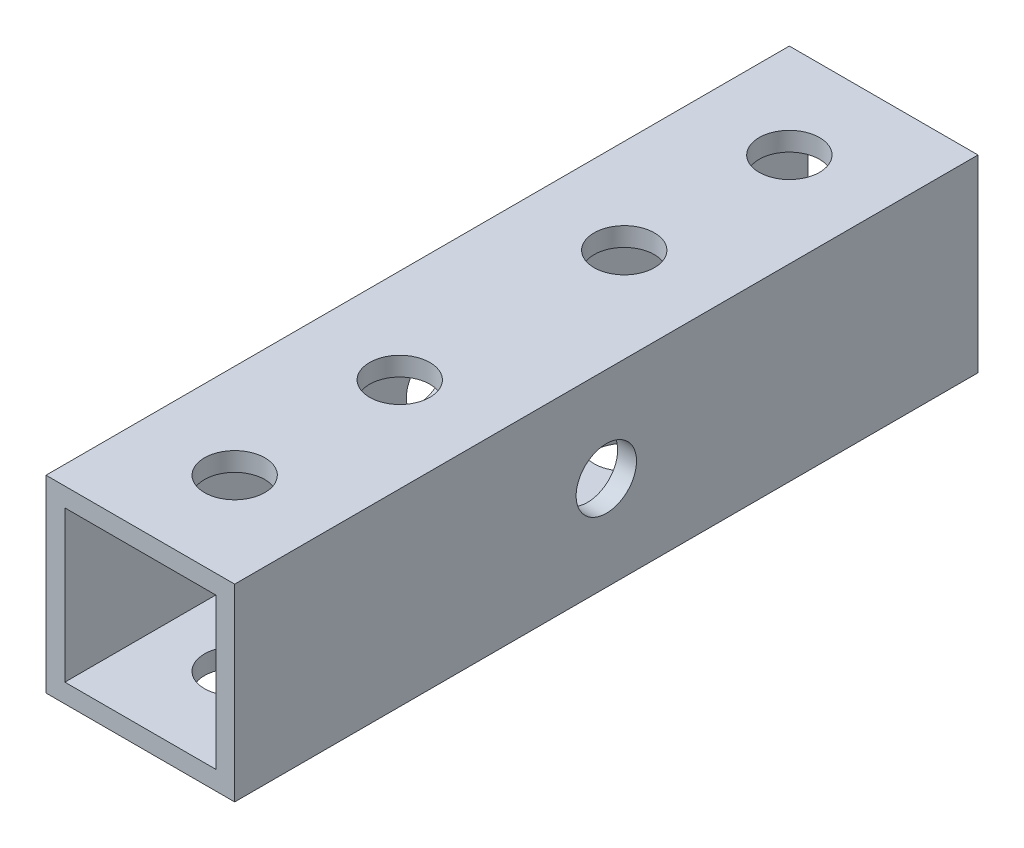
ISO-10303-21;
HEADER;
FILE_DESCRIPTION(('STEP AP214'),'2;1');
FILE_NAME('part.step','',(''),(''),'','','');
FILE_SCHEMA(('AUTOMOTIVE_DESIGN { 1 0 10303 214 1 1 1 1 }'));
ENDSEC;
DATA;
#1=APPLICATION_CONTEXT('core data for automotive mechanical design processes');
#2=APPLICATION_PROTOCOL_DEFINITION('international standard','automotive_design',2000,#1);
#3=PRODUCT_CONTEXT('',#1,'mechanical');
#4=PRODUCT('Part','Part','',(#3));
#5=PRODUCT_RELATED_PRODUCT_CATEGORY('part','',(#4));
#6=PRODUCT_DEFINITION_FORMATION('','',#4);
#7=PRODUCT_DEFINITION_CONTEXT('part definition',#1,'design');
#8=PRODUCT_DEFINITION('design','',#6,#7);
#9=PRODUCT_DEFINITION_SHAPE('','',#8);
#10=(LENGTH_UNIT() NAMED_UNIT(*) SI_UNIT(.MILLI.,.METRE.));
#11=(NAMED_UNIT(*) PLANE_ANGLE_UNIT() SI_UNIT($,.RADIAN.));
#12=(NAMED_UNIT(*) SI_UNIT($,.STERADIAN.) SOLID_ANGLE_UNIT());
#13=UNCERTAINTY_MEASURE_WITH_UNIT(LENGTH_MEASURE(1.E-05),#10,'distance_accuracy_value','');
#14=(GEOMETRIC_REPRESENTATION_CONTEXT(3) GLOBAL_UNCERTAINTY_ASSIGNED_CONTEXT((#13)) GLOBAL_UNIT_ASSIGNED_CONTEXT((#10,
#11,#12)) REPRESENTATION_CONTEXT('',''));
#15=CARTESIAN_POINT('',(0.,0.,0.));
#16=DIRECTION('',(0.,0.,1.));
#17=DIRECTION('',(1.,0.,0.));
#18=AXIS2_PLACEMENT_3D('',#15,#16,#17);
#19=CARTESIAN_POINT('',(0.,0.,39.4));
#20=DIRECTION('',(0.,0.,1.));
#21=DIRECTION('',(1.,0.,0.));
#22=AXIS2_PLACEMENT_3D('',#19,#20,#21);
#23=PLANE('',#22);
#24=DIRECTION('',(0.,1.,0.));
#25=VECTOR('',#24,1.);
#26=CARTESIAN_POINT('',(5.,-5.,39.4));
#27=LINE('',#26,#25);
#28=CARTESIAN_POINT('',(5.,-5.,39.4));
#29=VERTEX_POINT('',#28);
#30=CARTESIAN_POINT('',(5.,5.,39.4));
#31=VERTEX_POINT('',#30);
#32=EDGE_CURVE('E164',#29,#31,#27,.T.);
#33=ORIENTED_EDGE('',*,*,#32,.T.);
#34=DIRECTION('',(-1.,0.,0.));
#35=VECTOR('',#34,1.);
#36=CARTESIAN_POINT('',(-5.,5.,39.4));
#37=LINE('',#36,#35);
#38=CARTESIAN_POINT('',(-5.,5.,39.4));
#39=VERTEX_POINT('',#38);
#40=EDGE_CURVE('E167',#31,#39,#37,.T.);
#41=ORIENTED_EDGE('',*,*,#40,.T.);
#42=DIRECTION('',(0.,-1.,0.));
#43=VECTOR('',#42,1.);
#44=CARTESIAN_POINT('',(-5.,-5.,39.4));
#45=LINE('',#44,#43);
#46=CARTESIAN_POINT('',(-5.,-5.,39.4));
#47=VERTEX_POINT('',#46);
#48=EDGE_CURVE('E170',#39,#47,#45,.T.);
#49=ORIENTED_EDGE('',*,*,#48,.T.);
#50=DIRECTION('',(1.,0.,0.));
#51=VECTOR('',#50,1.);
#52=CARTESIAN_POINT('',(-5.,-5.,39.4));
#53=LINE('',#52,#51);
#54=EDGE_CURVE('E172',#47,#29,#53,.T.);
#55=ORIENTED_EDGE('',*,*,#54,.T.);
#56=EDGE_LOOP('',(#33,#41,#49,#55));
#57=FACE_BOUND('',#56,.T.);
#58=DIRECTION('',(-1.,0.,0.));
#59=VECTOR('',#58,1.);
#60=CARTESIAN_POINT('',(0.,4.,39.4));
#61=LINE('',#60,#59);
#62=CARTESIAN_POINT('',(4.,4.,39.4));
#63=VERTEX_POINT('',#62);
#64=CARTESIAN_POINT('',(-4.,4.,39.4));
#65=VERTEX_POINT('',#64);
#66=EDGE_CURVE('E134',#63,#65,#61,.T.);
#67=ORIENTED_EDGE('',*,*,#66,.F.);
#68=DIRECTION('',(0.,1.,0.));
#69=VECTOR('',#68,1.);
#70=CARTESIAN_POINT('',(4.,0.,39.4));
#71=LINE('',#70,#69);
#72=CARTESIAN_POINT('',(4.,-4.,39.4));
#73=VERTEX_POINT('',#72);
#74=EDGE_CURVE('E126',#73,#63,#71,.T.);
#75=ORIENTED_EDGE('',*,*,#74,.F.);
#76=DIRECTION('',(1.,0.,0.));
#77=VECTOR('',#76,1.);
#78=CARTESIAN_POINT('',(0.,-4.,39.4));
#79=LINE('',#78,#77);
#80=CARTESIAN_POINT('',(-4.,-4.,39.4));
#81=VERTEX_POINT('',#80);
#82=EDGE_CURVE('E148',#81,#73,#79,.T.);
#83=ORIENTED_EDGE('',*,*,#82,.F.);
#84=DIRECTION('',(0.,-1.,0.));
#85=VECTOR('',#84,1.);
#86=CARTESIAN_POINT('',(-4.,0.,39.4));
#87=LINE('',#86,#85);
#88=EDGE_CURVE('E146',#65,#81,#87,.T.);
#89=ORIENTED_EDGE('',*,*,#88,.F.);
#90=EDGE_LOOP('',(#67,#75,#83,#89));
#91=FACE_BOUND('',#90,.T.);
#92=ADVANCED_FACE('F59',(#57,#91),#23,.T.);
#93=CARTESIAN_POINT('',(0.,0.,0.));
#94=DIRECTION('',(0.,0.,1.));
#95=DIRECTION('',(1.,0.,0.));
#96=AXIS2_PLACEMENT_3D('',#93,#94,#95);
#97=PLANE('',#96);
#98=DIRECTION('',(0.,1.,0.));
#99=VECTOR('',#98,1.);
#100=CARTESIAN_POINT('',(5.,-5.,0.));
#101=LINE('',#100,#99);
#102=CARTESIAN_POINT('',(5.,-5.,0.));
#103=VERTEX_POINT('',#102);
#104=CARTESIAN_POINT('',(5.,5.,0.));
#105=VERTEX_POINT('',#104);
#106=EDGE_CURVE('E142',#103,#105,#101,.T.);
#107=ORIENTED_EDGE('',*,*,#106,.F.);
#108=DIRECTION('',(1.,0.,0.));
#109=VECTOR('',#108,1.);
#110=CARTESIAN_POINT('',(-5.,-5.,0.));
#111=LINE('',#110,#109);
#112=CARTESIAN_POINT('',(-5.,-5.,0.));
#113=VERTEX_POINT('',#112);
#114=EDGE_CURVE('E168',#113,#103,#111,.T.);
#115=ORIENTED_EDGE('',*,*,#114,.F.);
#116=DIRECTION('',(0.,-1.,0.));
#117=VECTOR('',#116,1.);
#118=CARTESIAN_POINT('',(-5.,-5.,0.));
#119=LINE('',#118,#117);
#120=CARTESIAN_POINT('',(-5.,5.,0.));
#121=VERTEX_POINT('',#120);
#122=EDGE_CURVE('E179',#121,#113,#119,.T.);
#123=ORIENTED_EDGE('',*,*,#122,.F.);
#124=DIRECTION('',(-1.,0.,0.));
#125=VECTOR('',#124,1.);
#126=CARTESIAN_POINT('',(-5.,5.,0.));
#127=LINE('',#126,#125);
#128=EDGE_CURVE('E177',#105,#121,#127,.T.);
#129=ORIENTED_EDGE('',*,*,#128,.F.);
#130=EDGE_LOOP('',(#107,#115,#123,#129));
#131=FACE_BOUND('',#130,.T.);
#132=DIRECTION('',(0.,1.,0.));
#133=VECTOR('',#132,1.);
#134=CARTESIAN_POINT('',(4.,0.,0.));
#135=LINE('',#134,#133);
#136=CARTESIAN_POINT('',(4.,-4.,0.));
#137=VERTEX_POINT('',#136);
#138=CARTESIAN_POINT('',(4.,4.,0.));
#139=VERTEX_POINT('',#138);
#140=EDGE_CURVE('E84',#137,#139,#135,.T.);
#141=ORIENTED_EDGE('',*,*,#140,.T.);
#142=DIRECTION('',(-1.,0.,0.));
#143=VECTOR('',#142,1.);
#144=CARTESIAN_POINT('',(0.,4.,0.));
#145=LINE('',#144,#143);
#146=CARTESIAN_POINT('',(-4.,4.,0.));
#147=VERTEX_POINT('',#146);
#148=EDGE_CURVE('E141',#139,#147,#145,.T.);
#149=ORIENTED_EDGE('',*,*,#148,.T.);
#150=DIRECTION('',(0.,-1.,0.));
#151=VECTOR('',#150,1.);
#152=CARTESIAN_POINT('',(-4.,0.,0.));
#153=LINE('',#152,#151);
#154=CARTESIAN_POINT('',(-4.,-4.,0.));
#155=VERTEX_POINT('',#154);
#156=EDGE_CURVE('E156',#147,#155,#153,.T.);
#157=ORIENTED_EDGE('',*,*,#156,.T.);
#158=DIRECTION('',(1.,0.,0.));
#159=VECTOR('',#158,1.);
#160=CARTESIAN_POINT('',(0.,-4.,0.));
#161=LINE('',#160,#159);
#162=EDGE_CURVE('E135',#155,#137,#161,.T.);
#163=ORIENTED_EDGE('',*,*,#162,.T.);
#164=EDGE_LOOP('',(#141,#149,#157,#163));
#165=FACE_BOUND('',#164,.T.);
#166=ADVANCED_FACE('F263',(#131,#165),#97,.F.);
#167=CARTESIAN_POINT('',(5.,-5.,39.4));
#168=DIRECTION('',(-1.,0.,0.));
#169=DIRECTION('',(0.,0.,1.));
#170=AXIS2_PLACEMENT_3D('',#167,#168,#169);
#171=PLANE('',#170);
#172=CARTESIAN_POINT('',(5.,0.,19.7));
#173=DIRECTION('',(1.,0.,0.));
#174=DIRECTION('',(0.,0.,-1.));
#175=AXIS2_PLACEMENT_3D('',#172,#173,#174);
#176=CIRCLE('',#175,1.6);
#177=CARTESIAN_POINT('',(5.,0.,18.1));
#178=VERTEX_POINT('',#177);
#179=EDGE_CURVE('E291',#178,#178,#176,.T.);
#180=ORIENTED_EDGE('',*,*,#179,.F.);
#181=EDGE_LOOP('',(#180));
#182=FACE_BOUND('',#181,.T.);
#183=ORIENTED_EDGE('',*,*,#106,.T.);
#184=DIRECTION('',(0.,0.,-1.));
#185=VECTOR('',#184,1.);
#186=CARTESIAN_POINT('',(5.,5.,39.4));
#187=LINE('',#186,#185);
#188=EDGE_CURVE('E12',#31,#105,#187,.T.);
#189=ORIENTED_EDGE('',*,*,#188,.F.);
#190=ORIENTED_EDGE('',*,*,#32,.F.);
#191=DIRECTION('',(0.,0.,-1.));
#192=VECTOR('',#191,1.);
#193=CARTESIAN_POINT('',(5.,-5.,39.4));
#194=LINE('',#193,#192);
#195=EDGE_CURVE('E174',#29,#103,#194,.T.);
#196=ORIENTED_EDGE('',*,*,#195,.T.);
#197=EDGE_LOOP('',(#183,#189,#190,#196));
#198=FACE_BOUND('',#197,.T.);
#199=ADVANCED_FACE('F61',(#182,#198),#171,.F.);
#200=CARTESIAN_POINT('',(-5.,5.,39.4));
#201=DIRECTION('',(0.,-1.,0.));
#202=DIRECTION('',(0.,0.,-1.));
#203=AXIS2_PLACEMENT_3D('',#200,#201,#202);
#204=PLANE('',#203);
#205=CARTESIAN_POINT('',(0.,5.,13.75));
#206=DIRECTION('',(0.,1.,0.));
#207=DIRECTION('',(0.,0.,1.));
#208=AXIS2_PLACEMENT_3D('',#205,#206,#207);
#209=CIRCLE('',#208,1.6);
#210=CARTESIAN_POINT('',(0.,5.,15.35));
#211=VERTEX_POINT('',#210);
#212=EDGE_CURVE('E302',#211,#211,#209,.T.);
#213=ORIENTED_EDGE('',*,*,#212,.F.);
#214=EDGE_LOOP('',(#213));
#215=FACE_BOUND('',#214,.T.);
#216=CARTESIAN_POINT('',(0.,5.,25.65));
#217=DIRECTION('',(0.,1.,0.));
#218=DIRECTION('',(0.,0.,-1.));
#219=AXIS2_PLACEMENT_3D('',#216,#217,#218);
#220=CIRCLE('',#219,1.6);
#221=CARTESIAN_POINT('',(0.,5.,24.05));
#222=VERTEX_POINT('',#221);
#223=EDGE_CURVE('E214',#222,#222,#220,.T.);
#224=ORIENTED_EDGE('',*,*,#223,.F.);
#225=EDGE_LOOP('',(#224));
#226=FACE_BOUND('',#225,.T.);
#227=CARTESIAN_POINT('',(0.,5.,5.));
#228=DIRECTION('',(0.,1.,0.));
#229=DIRECTION('',(0.,0.,1.));
#230=AXIS2_PLACEMENT_3D('',#227,#228,#229);
#231=CIRCLE('',#230,1.6);
#232=CARTESIAN_POINT('',(0.,5.,6.6));
#233=VERTEX_POINT('',#232);
#234=EDGE_CURVE('E219',#233,#233,#231,.T.);
#235=ORIENTED_EDGE('',*,*,#234,.F.);
#236=EDGE_LOOP('',(#235));
#237=FACE_BOUND('',#236,.T.);
#238=CARTESIAN_POINT('',(0.,5.,34.4));
#239=DIRECTION('',(0.,1.,0.));
#240=DIRECTION('',(0.,0.,-1.));
#241=AXIS2_PLACEMENT_3D('',#238,#239,#240);
#242=CIRCLE('',#241,1.6);
#243=CARTESIAN_POINT('',(0.,5.,32.8));
#244=VERTEX_POINT('',#243);
#245=EDGE_CURVE('E207',#244,#244,#242,.T.);
#246=ORIENTED_EDGE('',*,*,#245,.F.);
#247=EDGE_LOOP('',(#246));
#248=FACE_BOUND('',#247,.T.);
#249=ORIENTED_EDGE('',*,*,#128,.T.);
#250=DIRECTION('',(0.,0.,-1.));
#251=VECTOR('',#250,1.);
#252=CARTESIAN_POINT('',(-5.,5.,39.4));
#253=LINE('',#252,#251);
#254=EDGE_CURVE('E68',#39,#121,#253,.T.);
#255=ORIENTED_EDGE('',*,*,#254,.F.);
#256=ORIENTED_EDGE('',*,*,#40,.F.);
#257=ORIENTED_EDGE('',*,*,#188,.T.);
#258=EDGE_LOOP('',(#249,#255,#256,#257));
#259=FACE_BOUND('',#258,.T.);
#260=ADVANCED_FACE('F249',(#215,#226,#237,#248,#259),#204,.F.);
#261=CARTESIAN_POINT('',(-5.,-5.,39.4));
#262=DIRECTION('',(1.,0.,0.));
#263=DIRECTION('',(0.,0.,-1.));
#264=AXIS2_PLACEMENT_3D('',#261,#262,#263);
#265=PLANE('',#264);
#266=CARTESIAN_POINT('',(-5.,0.,19.7));
#267=DIRECTION('',(1.,0.,0.));
#268=DIRECTION('',(0.,0.,-1.));
#269=AXIS2_PLACEMENT_3D('',#266,#267,#268);
#270=CIRCLE('',#269,1.6);
#271=CARTESIAN_POINT('',(-5.,0.,18.1));
#272=VERTEX_POINT('',#271);
#273=EDGE_CURVE('E289',#272,#272,#270,.T.);
#274=ORIENTED_EDGE('',*,*,#273,.T.);
#275=EDGE_LOOP('',(#274));
#276=FACE_BOUND('',#275,.T.);
#277=ORIENTED_EDGE('',*,*,#122,.T.);
#278=DIRECTION('',(0.,0.,-1.));
#279=VECTOR('',#278,1.);
#280=CARTESIAN_POINT('',(-5.,-5.,39.4));
#281=LINE('',#280,#279);
#282=EDGE_CURVE('E184',#47,#113,#281,.T.);
#283=ORIENTED_EDGE('',*,*,#282,.F.);
#284=ORIENTED_EDGE('',*,*,#48,.F.);
#285=ORIENTED_EDGE('',*,*,#254,.T.);
#286=EDGE_LOOP('',(#277,#283,#284,#285));
#287=FACE_BOUND('',#286,.T.);
#288=ADVANCED_FACE('F252',(#276,#287),#265,.F.);
#289=CARTESIAN_POINT('',(-5.,-5.,39.4));
#290=DIRECTION('',(0.,1.,0.));
#291=DIRECTION('',(0.,0.,1.));
#292=AXIS2_PLACEMENT_3D('',#289,#290,#291);
#293=PLANE('',#292);
#294=CARTESIAN_POINT('',(0.,-5.,13.75));
#295=DIRECTION('',(0.,1.,0.));
#296=DIRECTION('',(0.,0.,1.));
#297=AXIS2_PLACEMENT_3D('',#294,#295,#296);
#298=CIRCLE('',#297,1.6);
#299=CARTESIAN_POINT('',(0.,-5.,15.35));
#300=VERTEX_POINT('',#299);
#301=EDGE_CURVE('E200',#300,#300,#298,.T.);
#302=ORIENTED_EDGE('',*,*,#301,.T.);
#303=EDGE_LOOP('',(#302));
#304=FACE_BOUND('',#303,.T.);
#305=CARTESIAN_POINT('',(0.,-5.,25.65));
#306=DIRECTION('',(0.,1.,0.));
#307=DIRECTION('',(0.,0.,-1.));
#308=AXIS2_PLACEMENT_3D('',#305,#306,#307);
#309=CIRCLE('',#308,1.6);
#310=CARTESIAN_POINT('',(0.,-5.,24.05));
#311=VERTEX_POINT('',#310);
#312=EDGE_CURVE('E304',#311,#311,#309,.T.);
#313=ORIENTED_EDGE('',*,*,#312,.T.);
#314=EDGE_LOOP('',(#313));
#315=FACE_BOUND('',#314,.T.);
#316=CARTESIAN_POINT('',(0.,-5.,5.));
#317=DIRECTION('',(0.,1.,0.));
#318=DIRECTION('',(0.,0.,1.));
#319=AXIS2_PLACEMENT_3D('',#316,#317,#318);
#320=CIRCLE('',#319,1.6);
#321=CARTESIAN_POINT('',(0.,-5.,6.6));
#322=VERTEX_POINT('',#321);
#323=EDGE_CURVE('E193',#322,#322,#320,.T.);
#324=ORIENTED_EDGE('',*,*,#323,.T.);
#325=EDGE_LOOP('',(#324));
#326=FACE_BOUND('',#325,.T.);
#327=CARTESIAN_POINT('',(0.,-5.,34.4));
#328=DIRECTION('',(0.,1.,0.));
#329=DIRECTION('',(0.,0.,-1.));
#330=AXIS2_PLACEMENT_3D('',#327,#328,#329);
#331=CIRCLE('',#330,1.6);
#332=CARTESIAN_POINT('',(0.,-5.,32.8));
#333=VERTEX_POINT('',#332);
#334=EDGE_CURVE('E222',#333,#333,#331,.T.);
#335=ORIENTED_EDGE('',*,*,#334,.T.);
#336=EDGE_LOOP('',(#335));
#337=FACE_BOUND('',#336,.T.);
#338=ORIENTED_EDGE('',*,*,#114,.T.);
#339=ORIENTED_EDGE('',*,*,#195,.F.);
#340=ORIENTED_EDGE('',*,*,#54,.F.);
#341=ORIENTED_EDGE('',*,*,#282,.T.);
#342=EDGE_LOOP('',(#338,#339,#340,#341));
#343=FACE_BOUND('',#342,.T.);
#344=ADVANCED_FACE('F267',(#304,#315,#326,#337,#343),#293,.F.);
#345=CARTESIAN_POINT('',(4.,0.,39.4));
#346=DIRECTION('',(-1.,0.,0.));
#347=DIRECTION('',(0.,0.,1.));
#348=AXIS2_PLACEMENT_3D('',#345,#346,#347);
#349=PLANE('',#348);
#350=CARTESIAN_POINT('',(4.,0.,19.7));
#351=DIRECTION('',(-1.,0.,0.));
#352=DIRECTION('',(0.,0.,1.));
#353=AXIS2_PLACEMENT_3D('',#350,#351,#352);
#354=CIRCLE('',#353,1.6);
#355=CARTESIAN_POINT('',(4.,0.,21.3));
#356=VERTEX_POINT('',#355);
#357=EDGE_CURVE('E294',#356,#356,#354,.T.);
#358=ORIENTED_EDGE('',*,*,#357,.F.);
#359=EDGE_LOOP('',(#358));
#360=FACE_BOUND('',#359,.T.);
#361=ORIENTED_EDGE('',*,*,#140,.F.);
#362=DIRECTION('',(0.,0.,-1.));
#363=VECTOR('',#362,1.);
#364=CARTESIAN_POINT('',(4.,-4.,39.4));
#365=LINE('',#364,#363);
#366=EDGE_CURVE('E130',#73,#137,#365,.T.);
#367=ORIENTED_EDGE('',*,*,#366,.F.);
#368=ORIENTED_EDGE('',*,*,#74,.T.);
#369=DIRECTION('',(0.,0.,-1.));
#370=VECTOR('',#369,1.);
#371=CARTESIAN_POINT('',(4.,4.,39.4));
#372=LINE('',#371,#370);
#373=EDGE_CURVE('E129',#63,#139,#372,.T.);
#374=ORIENTED_EDGE('',*,*,#373,.T.);
#375=EDGE_LOOP('',(#361,#367,#368,#374));
#376=FACE_BOUND('',#375,.T.);
#377=ADVANCED_FACE('F128',(#360,#376),#349,.T.);
#378=CARTESIAN_POINT('',(0.,4.,39.4));
#379=DIRECTION('',(0.,-1.,0.));
#380=DIRECTION('',(0.,0.,-1.));
#381=AXIS2_PLACEMENT_3D('',#378,#379,#380);
#382=PLANE('',#381);
#383=CARTESIAN_POINT('',(0.,4.,13.75));
#384=DIRECTION('',(0.,-1.,0.));
#385=DIRECTION('',(0.,0.,-1.));
#386=AXIS2_PLACEMENT_3D('',#383,#384,#385);
#387=CIRCLE('',#386,1.6);
#388=CARTESIAN_POINT('',(0.,4.,12.15));
#389=VERTEX_POINT('',#388);
#390=EDGE_CURVE('E203',#389,#389,#387,.T.);
#391=ORIENTED_EDGE('',*,*,#390,.F.);
#392=EDGE_LOOP('',(#391));
#393=FACE_BOUND('',#392,.T.);
#394=CARTESIAN_POINT('',(0.,4.,25.65));
#395=DIRECTION('',(0.,-1.,0.));
#396=DIRECTION('',(0.,0.,-1.));
#397=AXIS2_PLACEMENT_3D('',#394,#395,#396);
#398=CIRCLE('',#397,1.6);
#399=CARTESIAN_POINT('',(0.,4.,24.05));
#400=VERTEX_POINT('',#399);
#401=EDGE_CURVE('E199',#400,#400,#398,.T.);
#402=ORIENTED_EDGE('',*,*,#401,.F.);
#403=EDGE_LOOP('',(#402));
#404=FACE_BOUND('',#403,.T.);
#405=CARTESIAN_POINT('',(0.,4.,5.));
#406=DIRECTION('',(0.,-1.,0.));
#407=DIRECTION('',(0.,0.,-1.));
#408=AXIS2_PLACEMENT_3D('',#405,#406,#407);
#409=CIRCLE('',#408,1.6);
#410=CARTESIAN_POINT('',(0.,4.,3.4));
#411=VERTEX_POINT('',#410);
#412=EDGE_CURVE('E154',#411,#411,#409,.T.);
#413=ORIENTED_EDGE('',*,*,#412,.F.);
#414=EDGE_LOOP('',(#413));
#415=FACE_BOUND('',#414,.T.);
#416=CARTESIAN_POINT('',(0.,4.,34.4));
#417=DIRECTION('',(0.,-1.,0.));
#418=DIRECTION('',(0.,0.,-1.));
#419=AXIS2_PLACEMENT_3D('',#416,#417,#418);
#420=CIRCLE('',#419,1.6);
#421=CARTESIAN_POINT('',(0.,4.,32.8));
#422=VERTEX_POINT('',#421);
#423=EDGE_CURVE('E192',#422,#422,#420,.T.);
#424=ORIENTED_EDGE('',*,*,#423,.F.);
#425=EDGE_LOOP('',(#424));
#426=FACE_BOUND('',#425,.T.);
#427=ORIENTED_EDGE('',*,*,#148,.F.);
#428=ORIENTED_EDGE('',*,*,#373,.F.);
#429=ORIENTED_EDGE('',*,*,#66,.T.);
#430=DIRECTION('',(0.,0.,-1.));
#431=VECTOR('',#430,1.);
#432=CARTESIAN_POINT('',(-4.,4.,39.4));
#433=LINE('',#432,#431);
#434=EDGE_CURVE('E143',#65,#147,#433,.T.);
#435=ORIENTED_EDGE('',*,*,#434,.T.);
#436=EDGE_LOOP('',(#427,#428,#429,#435));
#437=FACE_BOUND('',#436,.T.);
#438=ADVANCED_FACE('F138',(#393,#404,#415,#426,#437),#382,.T.);
#439=CARTESIAN_POINT('',(-4.,0.,39.4));
#440=DIRECTION('',(1.,0.,0.));
#441=DIRECTION('',(0.,0.,-1.));
#442=AXIS2_PLACEMENT_3D('',#439,#440,#441);
#443=PLANE('',#442);
#444=CARTESIAN_POINT('',(-4.,0.,19.7));
#445=DIRECTION('',(1.,0.,0.));
#446=DIRECTION('',(0.,0.,-1.));
#447=AXIS2_PLACEMENT_3D('',#444,#445,#446);
#448=CIRCLE('',#447,1.6);
#449=CARTESIAN_POINT('',(-4.,0.,18.1));
#450=VERTEX_POINT('',#449);
#451=EDGE_CURVE('E63',#450,#450,#448,.T.);
#452=ORIENTED_EDGE('',*,*,#451,.F.);
#453=EDGE_LOOP('',(#452));
#454=FACE_BOUND('',#453,.T.);
#455=ORIENTED_EDGE('',*,*,#156,.F.);
#456=ORIENTED_EDGE('',*,*,#434,.F.);
#457=ORIENTED_EDGE('',*,*,#88,.T.);
#458=DIRECTION('',(0.,0.,-1.));
#459=VECTOR('',#458,1.);
#460=CARTESIAN_POINT('',(-4.,-4.,39.4));
#461=LINE('',#460,#459);
#462=EDGE_CURVE('E76',#81,#155,#461,.T.);
#463=ORIENTED_EDGE('',*,*,#462,.T.);
#464=EDGE_LOOP('',(#455,#456,#457,#463));
#465=FACE_BOUND('',#464,.T.);
#466=ADVANCED_FACE('F236',(#454,#465),#443,.T.);
#467=CARTESIAN_POINT('',(0.,-4.,39.4));
#468=DIRECTION('',(0.,1.,0.));
#469=DIRECTION('',(0.,0.,1.));
#470=AXIS2_PLACEMENT_3D('',#467,#468,#469);
#471=PLANE('',#470);
#472=CARTESIAN_POINT('',(0.,-4.,13.75));
#473=DIRECTION('',(0.,1.,0.));
#474=DIRECTION('',(0.,0.,1.));
#475=AXIS2_PLACEMENT_3D('',#472,#473,#474);
#476=CIRCLE('',#475,1.6);
#477=CARTESIAN_POINT('',(0.,-4.,15.35));
#478=VERTEX_POINT('',#477);
#479=EDGE_CURVE('E201',#478,#478,#476,.T.);
#480=ORIENTED_EDGE('',*,*,#479,.F.);
#481=EDGE_LOOP('',(#480));
#482=FACE_BOUND('',#481,.T.);
#483=CARTESIAN_POINT('',(0.,-4.,25.65));
#484=DIRECTION('',(0.,1.,0.));
#485=DIRECTION('',(0.,0.,1.));
#486=AXIS2_PLACEMENT_3D('',#483,#484,#485);
#487=CIRCLE('',#486,1.6);
#488=CARTESIAN_POINT('',(0.,-4.,27.25));
#489=VERTEX_POINT('',#488);
#490=EDGE_CURVE('E197',#489,#489,#487,.T.);
#491=ORIENTED_EDGE('',*,*,#490,.F.);
#492=EDGE_LOOP('',(#491));
#493=FACE_BOUND('',#492,.T.);
#494=CARTESIAN_POINT('',(0.,-4.,5.));
#495=DIRECTION('',(0.,1.,0.));
#496=DIRECTION('',(0.,0.,1.));
#497=AXIS2_PLACEMENT_3D('',#494,#495,#496);
#498=CIRCLE('',#497,1.6);
#499=CARTESIAN_POINT('',(0.,-4.,6.6));
#500=VERTEX_POINT('',#499);
#501=EDGE_CURVE('E194',#500,#500,#498,.T.);
#502=ORIENTED_EDGE('',*,*,#501,.F.);
#503=EDGE_LOOP('',(#502));
#504=FACE_BOUND('',#503,.T.);
#505=CARTESIAN_POINT('',(0.,-4.,34.4));
#506=DIRECTION('',(0.,1.,0.));
#507=DIRECTION('',(0.,0.,1.));
#508=AXIS2_PLACEMENT_3D('',#505,#506,#507);
#509=CIRCLE('',#508,1.6);
#510=CARTESIAN_POINT('',(0.,-4.,36.));
#511=VERTEX_POINT('',#510);
#512=EDGE_CURVE('E189',#511,#511,#509,.T.);
#513=ORIENTED_EDGE('',*,*,#512,.F.);
#514=EDGE_LOOP('',(#513));
#515=FACE_BOUND('',#514,.T.);
#516=ORIENTED_EDGE('',*,*,#162,.F.);
#517=ORIENTED_EDGE('',*,*,#462,.F.);
#518=ORIENTED_EDGE('',*,*,#82,.T.);
#519=ORIENTED_EDGE('',*,*,#366,.T.);
#520=EDGE_LOOP('',(#516,#517,#518,#519));
#521=FACE_BOUND('',#520,.T.);
#522=ADVANCED_FACE('F329',(#482,#493,#504,#515,#521),#471,.T.);
#523=CARTESIAN_POINT('',(0.,-5.,34.4));
#524=DIRECTION('',(0.,1.,0.));
#525=DIRECTION('',(0.,0.,1.));
#526=AXIS2_PLACEMENT_3D('',#523,#524,#525);
#527=CYLINDRICAL_SURFACE('',#526,1.6);
#528=ORIENTED_EDGE('',*,*,#512,.T.);
#529=EDGE_LOOP('',(#528));
#530=FACE_BOUND('',#529,.T.);
#531=ORIENTED_EDGE('',*,*,#334,.F.);
#532=EDGE_LOOP('',(#531));
#533=FACE_BOUND('',#532,.T.);
#534=ADVANCED_FACE('F246',(#530,#533),#527,.F.);
#535=CARTESIAN_POINT('',(0.,-5.,5.));
#536=DIRECTION('',(0.,1.,0.));
#537=DIRECTION('',(0.,0.,1.));
#538=AXIS2_PLACEMENT_3D('',#535,#536,#537);
#539=CYLINDRICAL_SURFACE('',#538,1.6);
#540=ORIENTED_EDGE('',*,*,#501,.T.);
#541=EDGE_LOOP('',(#540));
#542=FACE_BOUND('',#541,.T.);
#543=ORIENTED_EDGE('',*,*,#323,.F.);
#544=EDGE_LOOP('',(#543));
#545=FACE_BOUND('',#544,.T.);
#546=ADVANCED_FACE('F244',(#542,#545),#539,.F.);
#547=ORIENTED_EDGE('',*,*,#423,.T.);
#548=EDGE_LOOP('',(#547));
#549=FACE_BOUND('',#548,.T.);
#550=ORIENTED_EDGE('',*,*,#245,.T.);
#551=EDGE_LOOP('',(#550));
#552=FACE_BOUND('',#551,.T.);
#553=ADVANCED_FACE('F241',(#549,#552),#527,.F.);
#554=ORIENTED_EDGE('',*,*,#412,.T.);
#555=EDGE_LOOP('',(#554));
#556=FACE_BOUND('',#555,.T.);
#557=ORIENTED_EDGE('',*,*,#234,.T.);
#558=EDGE_LOOP('',(#557));
#559=FACE_BOUND('',#558,.T.);
#560=ADVANCED_FACE('F231',(#556,#559),#539,.F.);
#561=CARTESIAN_POINT('',(0.,-5.,25.65));
#562=DIRECTION('',(0.,1.,0.));
#563=DIRECTION('',(0.,0.,1.));
#564=AXIS2_PLACEMENT_3D('',#561,#562,#563);
#565=CYLINDRICAL_SURFACE('',#564,1.6);
#566=ORIENTED_EDGE('',*,*,#490,.T.);
#567=EDGE_LOOP('',(#566));
#568=FACE_BOUND('',#567,.T.);
#569=ORIENTED_EDGE('',*,*,#312,.F.);
#570=EDGE_LOOP('',(#569));
#571=FACE_BOUND('',#570,.T.);
#572=ADVANCED_FACE('F316',(#568,#571),#565,.F.);
#573=CARTESIAN_POINT('',(0.,-5.,13.75));
#574=DIRECTION('',(0.,1.,0.));
#575=DIRECTION('',(0.,0.,1.));
#576=AXIS2_PLACEMENT_3D('',#573,#574,#575);
#577=CYLINDRICAL_SURFACE('',#576,1.6);
#578=ORIENTED_EDGE('',*,*,#479,.T.);
#579=EDGE_LOOP('',(#578));
#580=FACE_BOUND('',#579,.T.);
#581=ORIENTED_EDGE('',*,*,#301,.F.);
#582=EDGE_LOOP('',(#581));
#583=FACE_BOUND('',#582,.T.);
#584=ADVANCED_FACE('F321',(#580,#583),#577,.F.);
#585=ORIENTED_EDGE('',*,*,#401,.T.);
#586=EDGE_LOOP('',(#585));
#587=FACE_BOUND('',#586,.T.);
#588=ORIENTED_EDGE('',*,*,#223,.T.);
#589=EDGE_LOOP('',(#588));
#590=FACE_BOUND('',#589,.T.);
#591=ADVANCED_FACE('F311',(#587,#590),#565,.F.);
#592=ORIENTED_EDGE('',*,*,#390,.T.);
#593=EDGE_LOOP('',(#592));
#594=FACE_BOUND('',#593,.T.);
#595=ORIENTED_EDGE('',*,*,#212,.T.);
#596=EDGE_LOOP('',(#595));
#597=FACE_BOUND('',#596,.T.);
#598=ADVANCED_FACE('F356',(#594,#597),#577,.F.);
#599=CARTESIAN_POINT('',(-5.,0.,19.7));
#600=DIRECTION('',(1.,0.,0.));
#601=DIRECTION('',(0.,0.,-1.));
#602=AXIS2_PLACEMENT_3D('',#599,#600,#601);
#603=CYLINDRICAL_SURFACE('',#602,1.6);
#604=ORIENTED_EDGE('',*,*,#451,.T.);
#605=EDGE_LOOP('',(#604));
#606=FACE_BOUND('',#605,.T.);
#607=ORIENTED_EDGE('',*,*,#273,.F.);
#608=EDGE_LOOP('',(#607));
#609=FACE_BOUND('',#608,.T.);
#610=ADVANCED_FACE('F353',(#606,#609),#603,.F.);
#611=ORIENTED_EDGE('',*,*,#357,.T.);
#612=EDGE_LOOP('',(#611));
#613=FACE_BOUND('',#612,.T.);
#614=ORIENTED_EDGE('',*,*,#179,.T.);
#615=EDGE_LOOP('',(#614));
#616=FACE_BOUND('',#615,.T.);
#617=ADVANCED_FACE('F355',(#613,#616),#603,.F.);
#618=CLOSED_SHELL('',(#92,#166,#199,#260,#288,#344,#377,#438,#466,#522,#534,#546,#553,#560,#572,
#584,#591,#598,#610,#617));
#619=MANIFOLD_SOLID_BREP('B2',#618);
#620=ADVANCED_BREP_SHAPE_REPRESENTATION('',(#18,#619),#14);
#621=SHAPE_DEFINITION_REPRESENTATION(#9,#620);
ENDSEC;
END-ISO-10303-21;
